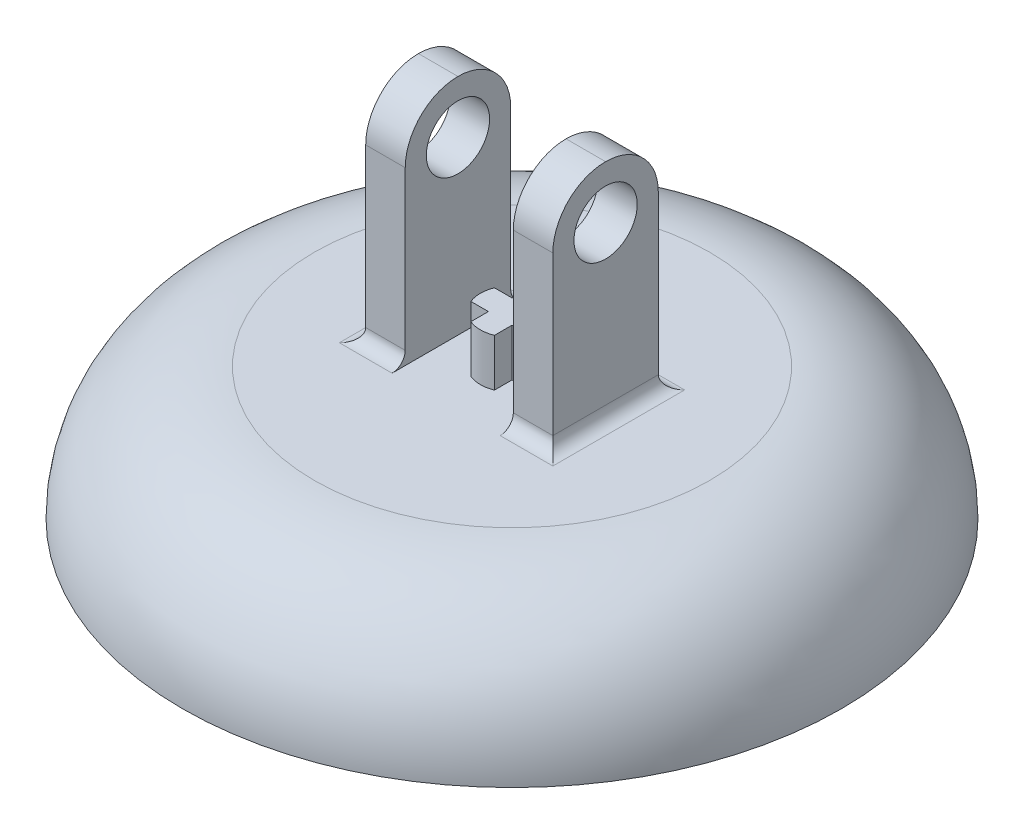
ISO-10303-21;
HEADER;
FILE_DESCRIPTION(('STEP AP214'),'2;1');
FILE_NAME('part.step','',(''),(''),'','','');
FILE_SCHEMA(('AUTOMOTIVE_DESIGN { 1 0 10303 214 1 1 1 1 }'));
ENDSEC;
DATA;
#1=APPLICATION_CONTEXT('core data for automotive mechanical design processes');
#2=APPLICATION_PROTOCOL_DEFINITION('international standard','automotive_design',2000,#1);
#3=PRODUCT_CONTEXT('',#1,'mechanical');
#4=PRODUCT('Part','Part','',(#3));
#5=PRODUCT_RELATED_PRODUCT_CATEGORY('part','',(#4));
#6=PRODUCT_DEFINITION_FORMATION('','',#4);
#7=PRODUCT_DEFINITION_CONTEXT('part definition',#1,'design');
#8=PRODUCT_DEFINITION('design','',#6,#7);
#9=PRODUCT_DEFINITION_SHAPE('','',#8);
#10=(LENGTH_UNIT() NAMED_UNIT(*) SI_UNIT(.MILLI.,.METRE.));
#11=(NAMED_UNIT(*) PLANE_ANGLE_UNIT() SI_UNIT($,.RADIAN.));
#12=(NAMED_UNIT(*) SI_UNIT($,.STERADIAN.) SOLID_ANGLE_UNIT());
#13=UNCERTAINTY_MEASURE_WITH_UNIT(LENGTH_MEASURE(1.E-05),#10,'distance_accuracy_value','');
#14=(GEOMETRIC_REPRESENTATION_CONTEXT(3) GLOBAL_UNCERTAINTY_ASSIGNED_CONTEXT((#13)) GLOBAL_UNIT_ASSIGNED_CONTEXT((#10,
#11,#12)) REPRESENTATION_CONTEXT('',''));
#15=CARTESIAN_POINT('',(0.,0.,0.));
#16=DIRECTION('',(0.,0.,1.));
#17=DIRECTION('',(1.,0.,0.));
#18=AXIS2_PLACEMENT_3D('',#15,#16,#17);
#19=CARTESIAN_POINT('',(0.,10.,0.));
#20=DIRECTION('',(0.,1.,0.));
#21=DIRECTION('',(0.,0.,1.));
#22=AXIS2_PLACEMENT_3D('',#19,#20,#21);
#23=PLANE('',#22);
#24=DIRECTION('',(1.,0.,0.));
#25=VECTOR('',#24,1.);
#26=CARTESIAN_POINT('',(4.1,10.,5.));
#27=LINE('',#26,#25);
#28=CARTESIAN_POINT('',(8.1,10.,5.));
#29=VERTEX_POINT('',#28);
#30=CARTESIAN_POINT('',(4.1,10.,5.));
#31=VERTEX_POINT('',#30);
#32=EDGE_CURVE('E288',#29,#31,#27,.F.);
#33=ORIENTED_EDGE('',*,*,#32,.T.);
#34=DIRECTION('',(0.,0.,1.));
#35=VECTOR('',#34,1.);
#36=CARTESIAN_POINT('',(4.1,10.,0.));
#37=LINE('',#36,#35);
#38=CARTESIAN_POINT('',(4.1,10.,-5.));
#39=VERTEX_POINT('',#38);
#40=EDGE_CURVE('E331',#39,#31,#37,.T.);
#41=ORIENTED_EDGE('',*,*,#40,.F.);
#42=DIRECTION('',(-1.,0.,0.));
#43=VECTOR('',#42,1.);
#44=CARTESIAN_POINT('',(7.1,10.,-5.));
#45=LINE('',#44,#43);
#46=CARTESIAN_POINT('',(8.1,10.,-5.));
#47=VERTEX_POINT('',#46);
#48=EDGE_CURVE('E284',#39,#47,#45,.F.);
#49=ORIENTED_EDGE('',*,*,#48,.T.);
#50=DIRECTION('',(0.,0.,-1.));
#51=VECTOR('',#50,1.);
#52=CARTESIAN_POINT('',(8.1,10.,4.));
#53=LINE('',#52,#51);
#54=EDGE_CURVE('E286',#47,#29,#53,.F.);
#55=ORIENTED_EDGE('',*,*,#54,.T.);
#56=EDGE_LOOP('',(#33,#41,#49,#55));
#57=FACE_BOUND('',#56,.T.);
#58=DIRECTION('',(-1.,0.,0.));
#59=VECTOR('',#58,1.);
#60=CARTESIAN_POINT('',(-4.1,10.,-5.));
#61=LINE('',#60,#59);
#62=CARTESIAN_POINT('',(-8.1,10.,-5.));
#63=VERTEX_POINT('',#62);
#64=CARTESIAN_POINT('',(-4.1,10.,-5.));
#65=VERTEX_POINT('',#64);
#66=EDGE_CURVE('E295',#63,#65,#61,.F.);
#67=ORIENTED_EDGE('',*,*,#66,.T.);
#68=DIRECTION('',(0.,0.,-1.));
#69=VECTOR('',#68,1.);
#70=CARTESIAN_POINT('',(-4.1,10.,0.));
#71=LINE('',#70,#69);
#72=CARTESIAN_POINT('',(-4.1,10.,5.));
#73=VERTEX_POINT('',#72);
#74=EDGE_CURVE('E351',#73,#65,#71,.T.);
#75=ORIENTED_EDGE('',*,*,#74,.F.);
#76=DIRECTION('',(1.,0.,0.));
#77=VECTOR('',#76,1.);
#78=CARTESIAN_POINT('',(-7.1,10.,5.));
#79=LINE('',#78,#77);
#80=CARTESIAN_POINT('',(-8.1,10.,5.));
#81=VERTEX_POINT('',#80);
#82=EDGE_CURVE('E291',#73,#81,#79,.F.);
#83=ORIENTED_EDGE('',*,*,#82,.T.);
#84=DIRECTION('',(0.,0.,1.));
#85=VECTOR('',#84,1.);
#86=CARTESIAN_POINT('',(-8.1,10.,-4.));
#87=LINE('',#86,#85);
#88=EDGE_CURVE('E293',#81,#63,#87,.F.);
#89=ORIENTED_EDGE('',*,*,#88,.T.);
#90=EDGE_LOOP('',(#67,#75,#83,#89));
#91=FACE_BOUND('',#90,.T.);
#92=CARTESIAN_POINT('',(0.,10.,0.));
#93=DIRECTION('',(0.,1.,0.));
#94=DIRECTION('',(0.,0.,1.));
#95=AXIS2_PLACEMENT_3D('',#92,#93,#94);
#96=CIRCLE('',#95,15.);
#97=CARTESIAN_POINT('',(0.,10.,15.));
#98=VERTEX_POINT('',#97);
#99=EDGE_CURVE('E239',#98,#98,#96,.T.);
#100=ORIENTED_EDGE('',*,*,#99,.T.);
#101=EDGE_LOOP('',(#100));
#102=FACE_BOUND('',#101,.T.);
#103=DIRECTION('',(0.,0.,-1.));
#104=VECTOR('',#103,1.);
#105=CARTESIAN_POINT('',(0.895,10.,2.22687561394883));
#106=LINE('',#105,#104);
#107=CARTESIAN_POINT('',(0.895,10.,2.22687561394883));
#108=VERTEX_POINT('',#107);
#109=CARTESIAN_POINT('',(0.895,10.,0.895));
#110=VERTEX_POINT('',#109);
#111=EDGE_CURVE('E381',#108,#110,#106,.T.);
#112=ORIENTED_EDGE('',*,*,#111,.F.);
#113=CARTESIAN_POINT('',(0.,10.,0.));
#114=DIRECTION('',(0.,1.,0.));
#115=DIRECTION('',(0.,0.,1.));
#116=AXIS2_PLACEMENT_3D('',#113,#114,#115);
#117=CIRCLE('',#116,2.4);
#118=CARTESIAN_POINT('',(-0.895,10.,2.22687561394883));
#119=VERTEX_POINT('',#118);
#120=EDGE_CURVE('E234',#119,#108,#117,.T.);
#121=ORIENTED_EDGE('',*,*,#120,.F.);
#122=DIRECTION('',(0.,0.,1.));
#123=VECTOR('',#122,1.);
#124=CARTESIAN_POINT('',(-0.895,10.,2.22687561394883));
#125=LINE('',#124,#123);
#126=CARTESIAN_POINT('',(-0.895,10.,0.895));
#127=VERTEX_POINT('',#126);
#128=EDGE_CURVE('E230',#127,#119,#125,.T.);
#129=ORIENTED_EDGE('',*,*,#128,.F.);
#130=DIRECTION('',(1.,0.,0.));
#131=VECTOR('',#130,1.);
#132=CARTESIAN_POINT('',(-2.22687561394883,10.,0.895));
#133=LINE('',#132,#131);
#134=CARTESIAN_POINT('',(-2.22687561394883,10.,0.895));
#135=VERTEX_POINT('',#134);
#136=EDGE_CURVE('E399',#135,#127,#133,.T.);
#137=ORIENTED_EDGE('',*,*,#136,.F.);
#138=CARTESIAN_POINT('',(0.,10.,0.));
#139=DIRECTION('',(0.,1.,0.));
#140=DIRECTION('',(0.,0.,1.));
#141=AXIS2_PLACEMENT_3D('',#138,#139,#140);
#142=CIRCLE('',#141,2.4);
#143=CARTESIAN_POINT('',(-2.22687561394883,10.,-0.895000000000001));
#144=VERTEX_POINT('',#143);
#145=EDGE_CURVE('E397',#144,#135,#142,.T.);
#146=ORIENTED_EDGE('',*,*,#145,.F.);
#147=DIRECTION('',(-1.,0.,0.));
#148=VECTOR('',#147,1.);
#149=CARTESIAN_POINT('',(-2.22687561394883,10.,-0.895));
#150=LINE('',#149,#148);
#151=CARTESIAN_POINT('',(-0.895,10.,-0.895));
#152=VERTEX_POINT('',#151);
#153=EDGE_CURVE('E395',#152,#144,#150,.T.);
#154=ORIENTED_EDGE('',*,*,#153,.F.);
#155=DIRECTION('',(0.,0.,1.));
#156=VECTOR('',#155,1.);
#157=CARTESIAN_POINT('',(-0.895,10.,-2.22687561394883));
#158=LINE('',#157,#156);
#159=CARTESIAN_POINT('',(-0.895,10.,-2.22687561394883));
#160=VERTEX_POINT('',#159);
#161=EDGE_CURVE('E393',#160,#152,#158,.T.);
#162=ORIENTED_EDGE('',*,*,#161,.F.);
#163=CARTESIAN_POINT('',(0.,10.,0.));
#164=DIRECTION('',(0.,1.,0.));
#165=DIRECTION('',(0.,0.,1.));
#166=AXIS2_PLACEMENT_3D('',#163,#164,#165);
#167=CIRCLE('',#166,2.4);
#168=CARTESIAN_POINT('',(0.895000000000001,10.,-2.22687561394883));
#169=VERTEX_POINT('',#168);
#170=EDGE_CURVE('E391',#169,#160,#167,.T.);
#171=ORIENTED_EDGE('',*,*,#170,.F.);
#172=DIRECTION('',(0.,0.,-1.));
#173=VECTOR('',#172,1.);
#174=CARTESIAN_POINT('',(0.895,10.,-2.22687561394883));
#175=LINE('',#174,#173);
#176=CARTESIAN_POINT('',(0.895,10.,-0.895));
#177=VERTEX_POINT('',#176);
#178=EDGE_CURVE('E389',#177,#169,#175,.T.);
#179=ORIENTED_EDGE('',*,*,#178,.F.);
#180=DIRECTION('',(-1.,0.,0.));
#181=VECTOR('',#180,1.);
#182=CARTESIAN_POINT('',(2.22687561394883,10.,-0.895));
#183=LINE('',#182,#181);
#184=CARTESIAN_POINT('',(2.22687561394883,10.,-0.895));
#185=VERTEX_POINT('',#184);
#186=EDGE_CURVE('E387',#185,#177,#183,.T.);
#187=ORIENTED_EDGE('',*,*,#186,.F.);
#188=CARTESIAN_POINT('',(0.,10.,0.));
#189=DIRECTION('',(0.,1.,0.));
#190=DIRECTION('',(0.,0.,1.));
#191=AXIS2_PLACEMENT_3D('',#188,#189,#190);
#192=CIRCLE('',#191,2.4);
#193=CARTESIAN_POINT('',(2.22687561394883,10.,0.895));
#194=VERTEX_POINT('',#193);
#195=EDGE_CURVE('E385',#194,#185,#192,.T.);
#196=ORIENTED_EDGE('',*,*,#195,.F.);
#197=DIRECTION('',(1.,0.,0.));
#198=VECTOR('',#197,1.);
#199=CARTESIAN_POINT('',(2.22687561394883,10.,0.895));
#200=LINE('',#199,#198);
#201=EDGE_CURVE('E383',#110,#194,#200,.T.);
#202=ORIENTED_EDGE('',*,*,#201,.F.);
#203=EDGE_LOOP('',(#112,#121,#129,#137,#146,#154,#162,#171,#179,#187,#196,#202));
#204=FACE_BOUND('',#203,.T.);
#205=ADVANCED_FACE('F33',(#57,#91,#102,#204),#23,.T.);
#206=CARTESIAN_POINT('',(0.,0.,0.));
#207=DIRECTION('',(0.,1.,0.));
#208=DIRECTION('',(0.,0.,1.));
#209=AXIS2_PLACEMENT_3D('',#206,#207,#208);
#210=PLANE('',#209);
#211=CARTESIAN_POINT('',(0.,0.,0.));
#212=DIRECTION('',(0.,1.,0.));
#213=DIRECTION('',(0.,0.,1.));
#214=AXIS2_PLACEMENT_3D('',#211,#212,#213);
#215=CIRCLE('',#214,25.);
#216=CARTESIAN_POINT('',(0.,0.,25.));
#217=VERTEX_POINT('',#216);
#218=EDGE_CURVE('E236',#217,#217,#215,.T.);
#219=ORIENTED_EDGE('',*,*,#218,.F.);
#220=EDGE_LOOP('',(#219));
#221=FACE_BOUND('',#220,.T.);
#222=ADVANCED_FACE('F459',(#221),#210,.F.);
#223=CARTESIAN_POINT('',(0.,0.,0.));
#224=DIRECTION('',(0.,1.,0.));
#225=DIRECTION('',(0.,0.,1.));
#226=AXIS2_PLACEMENT_3D('',#223,#224,#225);
#227=TOROIDAL_SURFACE('',#226,15.,10.);
#228=ORIENTED_EDGE('',*,*,#218,.T.);
#229=EDGE_LOOP('',(#228));
#230=FACE_BOUND('',#229,.T.);
#231=ORIENTED_EDGE('',*,*,#99,.F.);
#232=EDGE_LOOP('',(#231));
#233=FACE_BOUND('',#232,.T.);
#234=ADVANCED_FACE('F465',(#230,#233),#227,.T.);
#235=CARTESIAN_POINT('',(0.,13.6,0.));
#236=DIRECTION('',(0.,-1.,0.));
#237=DIRECTION('',(0.,0.,-1.));
#238=AXIS2_PLACEMENT_3D('',#235,#236,#237);
#239=CYLINDRICAL_SURFACE('',#238,2.4);
#240=ORIENTED_EDGE('',*,*,#120,.T.);
#241=DIRECTION('',(0.,-1.,0.));
#242=VECTOR('',#241,1.);
#243=CARTESIAN_POINT('',(0.895,13.6,2.22687561394883));
#244=LINE('',#243,#242);
#245=CARTESIAN_POINT('',(0.895,13.6,2.22687561394883));
#246=VERTEX_POINT('',#245);
#247=EDGE_CURVE('E214',#246,#108,#244,.T.);
#248=ORIENTED_EDGE('',*,*,#247,.F.);
#249=CARTESIAN_POINT('',(0.,13.6,0.));
#250=DIRECTION('',(0.,1.,0.));
#251=DIRECTION('',(0.,0.,1.));
#252=AXIS2_PLACEMENT_3D('',#249,#250,#251);
#253=CIRCLE('',#252,2.4);
#254=CARTESIAN_POINT('',(-0.895,13.6,2.22687561394883));
#255=VERTEX_POINT('',#254);
#256=EDGE_CURVE('E221',#255,#246,#253,.T.);
#257=ORIENTED_EDGE('',*,*,#256,.F.);
#258=DIRECTION('',(0.,-1.,0.));
#259=VECTOR('',#258,1.);
#260=CARTESIAN_POINT('',(-0.895,13.6,2.22687561394883));
#261=LINE('',#260,#259);
#262=EDGE_CURVE('E379',#255,#119,#261,.T.);
#263=ORIENTED_EDGE('',*,*,#262,.T.);
#264=EDGE_LOOP('',(#240,#248,#257,#263));
#265=FACE_BOUND('',#264,.T.);
#266=ADVANCED_FACE('F232',(#265),#239,.T.);
#267=CARTESIAN_POINT('',(0.895,13.6,2.22687561394883));
#268=DIRECTION('',(-1.,0.,0.));
#269=DIRECTION('',(0.,0.,1.));
#270=AXIS2_PLACEMENT_3D('',#267,#268,#269);
#271=PLANE('',#270);
#272=ORIENTED_EDGE('',*,*,#111,.T.);
#273=DIRECTION('',(0.,-1.,0.));
#274=VECTOR('',#273,1.);
#275=CARTESIAN_POINT('',(0.895,13.6,0.895));
#276=LINE('',#275,#274);
#277=CARTESIAN_POINT('',(0.895,13.6,0.895));
#278=VERTEX_POINT('',#277);
#279=EDGE_CURVE('E217',#278,#110,#276,.T.);
#280=ORIENTED_EDGE('',*,*,#279,.F.);
#281=DIRECTION('',(0.,0.,-1.));
#282=VECTOR('',#281,1.);
#283=CARTESIAN_POINT('',(0.895,13.6,2.22687561394883));
#284=LINE('',#283,#282);
#285=EDGE_CURVE('E210',#246,#278,#284,.T.);
#286=ORIENTED_EDGE('',*,*,#285,.F.);
#287=ORIENTED_EDGE('',*,*,#247,.T.);
#288=EDGE_LOOP('',(#272,#280,#286,#287));
#289=FACE_BOUND('',#288,.T.);
#290=ADVANCED_FACE('F212',(#289),#271,.F.);
#291=CARTESIAN_POINT('',(2.22687561394883,13.6,0.895));
#292=DIRECTION('',(0.,0.,-1.));
#293=DIRECTION('',(-1.,0.,0.));
#294=AXIS2_PLACEMENT_3D('',#291,#292,#293);
#295=PLANE('',#294);
#296=ORIENTED_EDGE('',*,*,#201,.T.);
#297=DIRECTION('',(0.,-1.,0.));
#298=VECTOR('',#297,1.);
#299=CARTESIAN_POINT('',(2.22687561394883,13.6,0.895));
#300=LINE('',#299,#298);
#301=CARTESIAN_POINT('',(2.22687561394883,13.6,0.895));
#302=VERTEX_POINT('',#301);
#303=EDGE_CURVE('E241',#302,#194,#300,.T.);
#304=ORIENTED_EDGE('',*,*,#303,.F.);
#305=DIRECTION('',(1.,0.,0.));
#306=VECTOR('',#305,1.);
#307=CARTESIAN_POINT('',(2.22687561394883,13.6,0.895));
#308=LINE('',#307,#306);
#309=EDGE_CURVE('E220',#278,#302,#308,.T.);
#310=ORIENTED_EDGE('',*,*,#309,.F.);
#311=ORIENTED_EDGE('',*,*,#279,.T.);
#312=EDGE_LOOP('',(#296,#304,#310,#311));
#313=FACE_BOUND('',#312,.T.);
#314=ADVANCED_FACE('F449',(#313),#295,.F.);
#315=CARTESIAN_POINT('',(0.,13.6,0.));
#316=DIRECTION('',(0.,-1.,0.));
#317=DIRECTION('',(0.,0.,-1.));
#318=AXIS2_PLACEMENT_3D('',#315,#316,#317);
#319=CYLINDRICAL_SURFACE('',#318,2.4);
#320=ORIENTED_EDGE('',*,*,#195,.T.);
#321=DIRECTION('',(0.,-1.,0.));
#322=VECTOR('',#321,1.);
#323=CARTESIAN_POINT('',(2.22687561394883,13.6,-0.895));
#324=LINE('',#323,#322);
#325=CARTESIAN_POINT('',(2.22687561394883,13.6,-0.895));
#326=VERTEX_POINT('',#325);
#327=EDGE_CURVE('E424',#326,#185,#324,.T.);
#328=ORIENTED_EDGE('',*,*,#327,.F.);
#329=CARTESIAN_POINT('',(0.,13.6,0.));
#330=DIRECTION('',(0.,1.,0.));
#331=DIRECTION('',(0.,0.,1.));
#332=AXIS2_PLACEMENT_3D('',#329,#330,#331);
#333=CIRCLE('',#332,2.4);
#334=EDGE_CURVE('E362',#302,#326,#333,.T.);
#335=ORIENTED_EDGE('',*,*,#334,.F.);
#336=ORIENTED_EDGE('',*,*,#303,.T.);
#337=EDGE_LOOP('',(#320,#328,#335,#336));
#338=FACE_BOUND('',#337,.T.);
#339=ADVANCED_FACE('F431',(#338),#319,.T.);
#340=CARTESIAN_POINT('',(2.22687561394883,13.6,-0.895));
#341=DIRECTION('',(0.,0.,1.));
#342=DIRECTION('',(1.,0.,0.));
#343=AXIS2_PLACEMENT_3D('',#340,#341,#342);
#344=PLANE('',#343);
#345=ORIENTED_EDGE('',*,*,#186,.T.);
#346=DIRECTION('',(0.,-1.,0.));
#347=VECTOR('',#346,1.);
#348=CARTESIAN_POINT('',(0.895,13.6,-0.895));
#349=LINE('',#348,#347);
#350=CARTESIAN_POINT('',(0.895,13.6,-0.895));
#351=VERTEX_POINT('',#350);
#352=EDGE_CURVE('E421',#351,#177,#349,.T.);
#353=ORIENTED_EDGE('',*,*,#352,.F.);
#354=DIRECTION('',(-1.,0.,0.));
#355=VECTOR('',#354,1.);
#356=CARTESIAN_POINT('',(2.22687561394883,13.6,-0.895));
#357=LINE('',#356,#355);
#358=EDGE_CURVE('E364',#326,#351,#357,.T.);
#359=ORIENTED_EDGE('',*,*,#358,.F.);
#360=ORIENTED_EDGE('',*,*,#327,.T.);
#361=EDGE_LOOP('',(#345,#353,#359,#360));
#362=FACE_BOUND('',#361,.T.);
#363=ADVANCED_FACE('F441',(#362),#344,.F.);
#364=CARTESIAN_POINT('',(0.895,13.6,-2.22687561394883));
#365=DIRECTION('',(-1.,0.,0.));
#366=DIRECTION('',(0.,0.,1.));
#367=AXIS2_PLACEMENT_3D('',#364,#365,#366);
#368=PLANE('',#367);
#369=ORIENTED_EDGE('',*,*,#178,.T.);
#370=DIRECTION('',(0.,-1.,0.));
#371=VECTOR('',#370,1.);
#372=CARTESIAN_POINT('',(0.895000000000001,13.6,-2.22687561394883));
#373=LINE('',#372,#371);
#374=CARTESIAN_POINT('',(0.895000000000001,13.6,-2.22687561394883));
#375=VERTEX_POINT('',#374);
#376=EDGE_CURVE('E418',#375,#169,#373,.T.);
#377=ORIENTED_EDGE('',*,*,#376,.F.);
#378=DIRECTION('',(0.,0.,-1.));
#379=VECTOR('',#378,1.);
#380=CARTESIAN_POINT('',(0.895,13.6,-2.22687561394883));
#381=LINE('',#380,#379);
#382=EDGE_CURVE('E366',#351,#375,#381,.T.);
#383=ORIENTED_EDGE('',*,*,#382,.F.);
#384=ORIENTED_EDGE('',*,*,#352,.T.);
#385=EDGE_LOOP('',(#369,#377,#383,#384));
#386=FACE_BOUND('',#385,.T.);
#387=ADVANCED_FACE('F445',(#386),#368,.F.);
#388=CARTESIAN_POINT('',(0.,13.6,0.));
#389=DIRECTION('',(0.,-1.,0.));
#390=DIRECTION('',(0.,0.,-1.));
#391=AXIS2_PLACEMENT_3D('',#388,#389,#390);
#392=CYLINDRICAL_SURFACE('',#391,2.4);
#393=ORIENTED_EDGE('',*,*,#170,.T.);
#394=DIRECTION('',(0.,-1.,0.));
#395=VECTOR('',#394,1.);
#396=CARTESIAN_POINT('',(-0.895,13.6,-2.22687561394883));
#397=LINE('',#396,#395);
#398=CARTESIAN_POINT('',(-0.895,13.6,-2.22687561394883));
#399=VERTEX_POINT('',#398);
#400=EDGE_CURVE('E415',#399,#160,#397,.T.);
#401=ORIENTED_EDGE('',*,*,#400,.F.);
#402=CARTESIAN_POINT('',(0.,13.6,0.));
#403=DIRECTION('',(0.,1.,0.));
#404=DIRECTION('',(0.,0.,1.));
#405=AXIS2_PLACEMENT_3D('',#402,#403,#404);
#406=CIRCLE('',#405,2.4);
#407=EDGE_CURVE('E368',#375,#399,#406,.T.);
#408=ORIENTED_EDGE('',*,*,#407,.F.);
#409=ORIENTED_EDGE('',*,*,#376,.T.);
#410=EDGE_LOOP('',(#393,#401,#408,#409));
#411=FACE_BOUND('',#410,.T.);
#412=ADVANCED_FACE('F661',(#411),#392,.T.);
#413=CARTESIAN_POINT('',(-0.895,13.6,-2.22687561394883));
#414=DIRECTION('',(1.,0.,0.));
#415=DIRECTION('',(0.,0.,-1.));
#416=AXIS2_PLACEMENT_3D('',#413,#414,#415);
#417=PLANE('',#416);
#418=ORIENTED_EDGE('',*,*,#161,.T.);
#419=DIRECTION('',(0.,-1.,0.));
#420=VECTOR('',#419,1.);
#421=CARTESIAN_POINT('',(-0.895,13.6,-0.895));
#422=LINE('',#421,#420);
#423=CARTESIAN_POINT('',(-0.895,13.6,-0.895));
#424=VERTEX_POINT('',#423);
#425=EDGE_CURVE('E412',#424,#152,#422,.T.);
#426=ORIENTED_EDGE('',*,*,#425,.F.);
#427=DIRECTION('',(0.,0.,1.));
#428=VECTOR('',#427,1.);
#429=CARTESIAN_POINT('',(-0.895,13.6,-2.22687561394883));
#430=LINE('',#429,#428);
#431=EDGE_CURVE('E370',#399,#424,#430,.T.);
#432=ORIENTED_EDGE('',*,*,#431,.F.);
#433=ORIENTED_EDGE('',*,*,#400,.T.);
#434=EDGE_LOOP('',(#418,#426,#432,#433));
#435=FACE_BOUND('',#434,.T.);
#436=ADVANCED_FACE('F653',(#435),#417,.F.);
#437=CARTESIAN_POINT('',(-2.22687561394883,13.6,-0.895));
#438=DIRECTION('',(0.,0.,1.));
#439=DIRECTION('',(1.,0.,0.));
#440=AXIS2_PLACEMENT_3D('',#437,#438,#439);
#441=PLANE('',#440);
#442=ORIENTED_EDGE('',*,*,#153,.T.);
#443=DIRECTION('',(0.,-1.,0.));
#444=VECTOR('',#443,1.);
#445=CARTESIAN_POINT('',(-2.22687561394883,13.6,-0.895000000000001));
#446=LINE('',#445,#444);
#447=CARTESIAN_POINT('',(-2.22687561394883,13.6,-0.895000000000001));
#448=VERTEX_POINT('',#447);
#449=EDGE_CURVE('E409',#448,#144,#446,.T.);
#450=ORIENTED_EDGE('',*,*,#449,.F.);
#451=DIRECTION('',(-1.,0.,0.));
#452=VECTOR('',#451,1.);
#453=CARTESIAN_POINT('',(-2.22687561394883,13.6,-0.895));
#454=LINE('',#453,#452);
#455=EDGE_CURVE('E372',#424,#448,#454,.T.);
#456=ORIENTED_EDGE('',*,*,#455,.F.);
#457=ORIENTED_EDGE('',*,*,#425,.T.);
#458=EDGE_LOOP('',(#442,#450,#456,#457));
#459=FACE_BOUND('',#458,.T.);
#460=ADVANCED_FACE('F645',(#459),#441,.F.);
#461=CARTESIAN_POINT('',(0.,13.6,0.));
#462=DIRECTION('',(0.,-1.,0.));
#463=DIRECTION('',(0.,0.,-1.));
#464=AXIS2_PLACEMENT_3D('',#461,#462,#463);
#465=CYLINDRICAL_SURFACE('',#464,2.4);
#466=ORIENTED_EDGE('',*,*,#145,.T.);
#467=DIRECTION('',(0.,-1.,0.));
#468=VECTOR('',#467,1.);
#469=CARTESIAN_POINT('',(-2.22687561394883,13.6,0.895));
#470=LINE('',#469,#468);
#471=CARTESIAN_POINT('',(-2.22687561394883,13.6,0.895));
#472=VERTEX_POINT('',#471);
#473=EDGE_CURVE('E406',#472,#135,#470,.T.);
#474=ORIENTED_EDGE('',*,*,#473,.F.);
#475=CARTESIAN_POINT('',(0.,13.6,0.));
#476=DIRECTION('',(0.,1.,0.));
#477=DIRECTION('',(0.,0.,1.));
#478=AXIS2_PLACEMENT_3D('',#475,#476,#477);
#479=CIRCLE('',#478,2.4);
#480=EDGE_CURVE('E374',#448,#472,#479,.T.);
#481=ORIENTED_EDGE('',*,*,#480,.F.);
#482=ORIENTED_EDGE('',*,*,#449,.T.);
#483=EDGE_LOOP('',(#466,#474,#481,#482));
#484=FACE_BOUND('',#483,.T.);
#485=ADVANCED_FACE('F637',(#484),#465,.T.);
#486=CARTESIAN_POINT('',(-2.22687561394883,13.6,0.895));
#487=DIRECTION('',(0.,0.,-1.));
#488=DIRECTION('',(-1.,0.,0.));
#489=AXIS2_PLACEMENT_3D('',#486,#487,#488);
#490=PLANE('',#489);
#491=ORIENTED_EDGE('',*,*,#136,.T.);
#492=DIRECTION('',(0.,-1.,0.));
#493=VECTOR('',#492,1.);
#494=CARTESIAN_POINT('',(-0.895,13.6,0.895));
#495=LINE('',#494,#493);
#496=CARTESIAN_POINT('',(-0.895,13.6,0.895));
#497=VERTEX_POINT('',#496);
#498=EDGE_CURVE('E404',#497,#127,#495,.T.);
#499=ORIENTED_EDGE('',*,*,#498,.F.);
#500=DIRECTION('',(1.,0.,0.));
#501=VECTOR('',#500,1.);
#502=CARTESIAN_POINT('',(-2.22687561394883,13.6,0.895));
#503=LINE('',#502,#501);
#504=EDGE_CURVE('E376',#472,#497,#503,.T.);
#505=ORIENTED_EDGE('',*,*,#504,.F.);
#506=ORIENTED_EDGE('',*,*,#473,.T.);
#507=EDGE_LOOP('',(#491,#499,#505,#506));
#508=FACE_BOUND('',#507,.T.);
#509=ADVANCED_FACE('F629',(#508),#490,.F.);
#510=CARTESIAN_POINT('',(-0.895,13.6,2.22687561394883));
#511=DIRECTION('',(1.,0.,0.));
#512=DIRECTION('',(0.,0.,-1.));
#513=AXIS2_PLACEMENT_3D('',#510,#511,#512);
#514=PLANE('',#513);
#515=ORIENTED_EDGE('',*,*,#128,.T.);
#516=ORIENTED_EDGE('',*,*,#262,.F.);
#517=DIRECTION('',(0.,0.,1.));
#518=VECTOR('',#517,1.);
#519=CARTESIAN_POINT('',(-0.895,13.6,2.22687561394883));
#520=LINE('',#519,#518);
#521=EDGE_CURVE('E226',#497,#255,#520,.T.);
#522=ORIENTED_EDGE('',*,*,#521,.F.);
#523=ORIENTED_EDGE('',*,*,#498,.T.);
#524=EDGE_LOOP('',(#515,#516,#522,#523));
#525=FACE_BOUND('',#524,.T.);
#526=ADVANCED_FACE('F622',(#525),#514,.F.);
#527=CARTESIAN_POINT('',(0.,13.6,0.));
#528=DIRECTION('',(0.,1.,0.));
#529=DIRECTION('',(0.,0.,1.));
#530=AXIS2_PLACEMENT_3D('',#527,#528,#529);
#531=PLANE('',#530);
#532=ORIENTED_EDGE('',*,*,#256,.T.);
#533=ORIENTED_EDGE('',*,*,#285,.T.);
#534=ORIENTED_EDGE('',*,*,#309,.T.);
#535=ORIENTED_EDGE('',*,*,#334,.T.);
#536=ORIENTED_EDGE('',*,*,#358,.T.);
#537=ORIENTED_EDGE('',*,*,#382,.T.);
#538=ORIENTED_EDGE('',*,*,#407,.T.);
#539=ORIENTED_EDGE('',*,*,#431,.T.);
#540=ORIENTED_EDGE('',*,*,#455,.T.);
#541=ORIENTED_EDGE('',*,*,#480,.T.);
#542=ORIENTED_EDGE('',*,*,#504,.T.);
#543=ORIENTED_EDGE('',*,*,#521,.T.);
#544=EDGE_LOOP('',(#532,#533,#534,#535,#536,#537,#538,#539,#540,#541,#542,#543));
#545=FACE_BOUND('',#544,.T.);
#546=ADVANCED_FACE('F224',(#545),#531,.T.);
#547=CARTESIAN_POINT('',(-7.1,27.,4.));
#548=DIRECTION('',(-1.,0.,0.));
#549=DIRECTION('',(0.,0.,1.));
#550=AXIS2_PLACEMENT_3D('',#547,#548,#549);
#551=PLANE('',#550);
#552=CARTESIAN_POINT('',(-7.1,23.,0.));
#553=DIRECTION('',(-1.,0.,0.));
#554=DIRECTION('',(0.,0.,1.));
#555=AXIS2_PLACEMENT_3D('',#552,#553,#554);
#556=CIRCLE('',#555,2.4);
#557=CARTESIAN_POINT('',(-7.1,23.,2.4));
#558=VERTEX_POINT('',#557);
#559=EDGE_CURVE('E336',#558,#558,#556,.T.);
#560=ORIENTED_EDGE('',*,*,#559,.F.);
#561=EDGE_LOOP('',(#560));
#562=FACE_BOUND('',#561,.T.);
#563=DIRECTION('',(0.,-1.,0.));
#564=VECTOR('',#563,1.);
#565=CARTESIAN_POINT('',(-7.1,27.,-4.));
#566=LINE('',#565,#564);
#567=CARTESIAN_POINT('',(-7.1,23.,-4.));
#568=VERTEX_POINT('',#567);
#569=CARTESIAN_POINT('',(-7.1,11.,-4.));
#570=VERTEX_POINT('',#569);
#571=EDGE_CURVE('E346',#568,#570,#566,.T.);
#572=ORIENTED_EDGE('',*,*,#571,.T.);
#573=DIRECTION('',(0.,0.,1.));
#574=VECTOR('',#573,1.);
#575=CARTESIAN_POINT('',(-7.1,11.,4.));
#576=LINE('',#575,#574);
#577=CARTESIAN_POINT('',(-7.1,11.,4.));
#578=VERTEX_POINT('',#577);
#579=EDGE_CURVE('E298',#570,#578,#576,.T.);
#580=ORIENTED_EDGE('',*,*,#579,.T.);
#581=DIRECTION('',(0.,-1.,0.));
#582=VECTOR('',#581,1.);
#583=CARTESIAN_POINT('',(-7.1,27.,4.));
#584=LINE('',#583,#582);
#585=CARTESIAN_POINT('',(-7.1,23.,4.));
#586=VERTEX_POINT('',#585);
#587=EDGE_CURVE('E348',#586,#578,#584,.T.);
#588=ORIENTED_EDGE('',*,*,#587,.F.);
#589=CARTESIAN_POINT('',(-7.1,23.,0.));
#590=DIRECTION('',(-1.,0.,0.));
#591=DIRECTION('',(0.,0.,1.));
#592=AXIS2_PLACEMENT_3D('',#589,#590,#591);
#593=CIRCLE('',#592,4.);
#594=CARTESIAN_POINT('',(-7.1,27.,0.));
#595=VERTEX_POINT('',#594);
#596=EDGE_CURVE('E265',#586,#595,#593,.T.);
#597=ORIENTED_EDGE('',*,*,#596,.T.);
#598=CARTESIAN_POINT('',(-7.1,23.,0.));
#599=DIRECTION('',(-1.,0.,0.));
#600=DIRECTION('',(0.,0.,1.));
#601=AXIS2_PLACEMENT_3D('',#598,#599,#600);
#602=CIRCLE('',#601,4.);
#603=EDGE_CURVE('E263',#595,#568,#602,.T.);
#604=ORIENTED_EDGE('',*,*,#603,.T.);
#605=EDGE_LOOP('',(#572,#580,#588,#597,#604));
#606=FACE_BOUND('',#605,.T.);
#607=ADVANCED_FACE('F607',(#562,#606),#551,.T.);
#608=CARTESIAN_POINT('',(-7.1,27.,4.));
#609=DIRECTION('',(0.,0.,1.));
#610=DIRECTION('',(1.,0.,0.));
#611=AXIS2_PLACEMENT_3D('',#608,#609,#610);
#612=PLANE('',#611);
#613=ORIENTED_EDGE('',*,*,#587,.T.);
#614=DIRECTION('',(1.,0.,0.));
#615=VECTOR('',#614,1.);
#616=CARTESIAN_POINT('',(-4.1,11.,4.));
#617=LINE('',#616,#615);
#618=CARTESIAN_POINT('',(-4.1,11.,4.));
#619=VERTEX_POINT('',#618);
#620=EDGE_CURVE('E300',#578,#619,#617,.T.);
#621=ORIENTED_EDGE('',*,*,#620,.T.);
#622=DIRECTION('',(0.,-1.,0.));
#623=VECTOR('',#622,1.);
#624=CARTESIAN_POINT('',(-4.1,27.,4.));
#625=LINE('',#624,#623);
#626=CARTESIAN_POINT('',(-4.1,23.,4.));
#627=VERTEX_POINT('',#626);
#628=EDGE_CURVE('E352',#627,#619,#625,.T.);
#629=ORIENTED_EDGE('',*,*,#628,.F.);
#630=DIRECTION('',(-1.,0.,0.));
#631=VECTOR('',#630,1.);
#632=CARTESIAN_POINT('',(-7.1,23.,4.));
#633=LINE('',#632,#631);
#634=EDGE_CURVE('E260',#627,#586,#633,.T.);
#635=ORIENTED_EDGE('',*,*,#634,.T.);
#636=EDGE_LOOP('',(#613,#621,#629,#635));
#637=FACE_BOUND('',#636,.T.);
#638=ADVANCED_FACE('F599',(#637),#612,.T.);
#639=CARTESIAN_POINT('',(-4.1,27.,4.));
#640=DIRECTION('',(1.,0.,0.));
#641=DIRECTION('',(0.,0.,-1.));
#642=AXIS2_PLACEMENT_3D('',#639,#640,#641);
#643=PLANE('',#642);
#644=CARTESIAN_POINT('',(-4.1,23.,0.));
#645=DIRECTION('',(1.,0.,0.));
#646=DIRECTION('',(0.,0.,-1.));
#647=AXIS2_PLACEMENT_3D('',#644,#645,#646);
#648=CIRCLE('',#647,2.4);
#649=CARTESIAN_POINT('',(-4.1,23.,-2.4));
#650=VERTEX_POINT('',#649);
#651=EDGE_CURVE('E341',#650,#650,#648,.T.);
#652=ORIENTED_EDGE('',*,*,#651,.F.);
#653=EDGE_LOOP('',(#652));
#654=FACE_BOUND('',#653,.T.);
#655=CARTESIAN_POINT('',(-4.1,23.,0.));
#656=DIRECTION('',(1.,0.,0.));
#657=DIRECTION('',(0.,0.,-1.));
#658=AXIS2_PLACEMENT_3D('',#655,#656,#657);
#659=CIRCLE('',#658,4.);
#660=CARTESIAN_POINT('',(-4.1,23.,-4.));
#661=VERTEX_POINT('',#660);
#662=CARTESIAN_POINT('',(-4.1,27.,0.));
#663=VERTEX_POINT('',#662);
#664=EDGE_CURVE('E267',#661,#663,#659,.T.);
#665=ORIENTED_EDGE('',*,*,#664,.T.);
#666=CARTESIAN_POINT('',(-4.1,23.,0.));
#667=DIRECTION('',(1.,0.,0.));
#668=DIRECTION('',(0.,0.,-1.));
#669=AXIS2_PLACEMENT_3D('',#666,#667,#668);
#670=CIRCLE('',#669,4.);
#671=EDGE_CURVE('E269',#663,#627,#670,.T.);
#672=ORIENTED_EDGE('',*,*,#671,.T.);
#673=ORIENTED_EDGE('',*,*,#628,.T.);
#674=CARTESIAN_POINT('',(-4.1,11.,5.));
#675=DIRECTION('',(1.,0.,0.));
#676=DIRECTION('',(0.,0.,-1.));
#677=AXIS2_PLACEMENT_3D('',#674,#675,#676);
#678=CIRCLE('',#677,1.);
#679=EDGE_CURVE('E309',#619,#73,#678,.F.);
#680=ORIENTED_EDGE('',*,*,#679,.T.);
#681=ORIENTED_EDGE('',*,*,#74,.T.);
#682=CARTESIAN_POINT('',(-4.1,11.,-5.));
#683=DIRECTION('',(1.,0.,0.));
#684=DIRECTION('',(0.,0.,-1.));
#685=AXIS2_PLACEMENT_3D('',#682,#683,#684);
#686=CIRCLE('',#685,1.);
#687=CARTESIAN_POINT('',(-4.1,11.,-4.));
#688=VERTEX_POINT('',#687);
#689=EDGE_CURVE('E307',#65,#688,#686,.F.);
#690=ORIENTED_EDGE('',*,*,#689,.T.);
#691=DIRECTION('',(0.,-1.,0.));
#692=VECTOR('',#691,1.);
#693=CARTESIAN_POINT('',(-4.1,27.,-4.));
#694=LINE('',#693,#692);
#695=EDGE_CURVE('E355',#661,#688,#694,.T.);
#696=ORIENTED_EDGE('',*,*,#695,.F.);
#697=EDGE_LOOP('',(#665,#672,#673,#680,#681,#690,#696));
#698=FACE_BOUND('',#697,.T.);
#699=ADVANCED_FACE('F591',(#654,#698),#643,.T.);
#700=CARTESIAN_POINT('',(-7.1,27.,-4.));
#701=DIRECTION('',(0.,0.,-1.));
#702=DIRECTION('',(-1.,0.,0.));
#703=AXIS2_PLACEMENT_3D('',#700,#701,#702);
#704=PLANE('',#703);
#705=ORIENTED_EDGE('',*,*,#695,.T.);
#706=DIRECTION('',(-1.,0.,0.));
#707=VECTOR('',#706,1.);
#708=CARTESIAN_POINT('',(-7.1,11.,-4.));
#709=LINE('',#708,#707);
#710=EDGE_CURVE('E273',#688,#570,#709,.T.);
#711=ORIENTED_EDGE('',*,*,#710,.T.);
#712=ORIENTED_EDGE('',*,*,#571,.F.);
#713=DIRECTION('',(1.,0.,0.));
#714=VECTOR('',#713,1.);
#715=CARTESIAN_POINT('',(-4.1,23.,-4.));
#716=LINE('',#715,#714);
#717=EDGE_CURVE('E271',#568,#661,#716,.T.);
#718=ORIENTED_EDGE('',*,*,#717,.T.);
#719=EDGE_LOOP('',(#705,#711,#712,#718));
#720=FACE_BOUND('',#719,.T.);
#721=ADVANCED_FACE('F583',(#720),#704,.T.);
#722=CARTESIAN_POINT('',(4.1,27.,4.));
#723=DIRECTION('',(-1.,0.,0.));
#724=DIRECTION('',(0.,0.,1.));
#725=AXIS2_PLACEMENT_3D('',#722,#723,#724);
#726=PLANE('',#725);
#727=CARTESIAN_POINT('',(4.1,23.,0.));
#728=DIRECTION('',(-1.,0.,0.));
#729=DIRECTION('',(0.,0.,1.));
#730=AXIS2_PLACEMENT_3D('',#727,#728,#729);
#731=CIRCLE('',#730,2.4);
#732=CARTESIAN_POINT('',(4.1,23.,2.4));
#733=VERTEX_POINT('',#732);
#734=EDGE_CURVE('E828',#733,#733,#731,.T.);
#735=ORIENTED_EDGE('',*,*,#734,.F.);
#736=EDGE_LOOP('',(#735));
#737=FACE_BOUND('',#736,.T.);
#738=CARTESIAN_POINT('',(4.1,23.,0.));
#739=DIRECTION('',(-1.,0.,0.));
#740=DIRECTION('',(0.,0.,1.));
#741=AXIS2_PLACEMENT_3D('',#738,#739,#740);
#742=CIRCLE('',#741,4.);
#743=CARTESIAN_POINT('',(4.1,23.,4.));
#744=VERTEX_POINT('',#743);
#745=CARTESIAN_POINT('',(4.1,27.,0.));
#746=VERTEX_POINT('',#745);
#747=EDGE_CURVE('E254',#744,#746,#742,.T.);
#748=ORIENTED_EDGE('',*,*,#747,.T.);
#749=CARTESIAN_POINT('',(4.1,23.,0.));
#750=DIRECTION('',(-1.,0.,0.));
#751=DIRECTION('',(0.,0.,1.));
#752=AXIS2_PLACEMENT_3D('',#749,#750,#751);
#753=CIRCLE('',#752,4.);
#754=CARTESIAN_POINT('',(4.1,23.,-4.));
#755=VERTEX_POINT('',#754);
#756=EDGE_CURVE('E256',#746,#755,#753,.T.);
#757=ORIENTED_EDGE('',*,*,#756,.T.);
#758=DIRECTION('',(0.,-1.,0.));
#759=VECTOR('',#758,1.);
#760=CARTESIAN_POINT('',(4.1,27.,-4.));
#761=LINE('',#760,#759);
#762=CARTESIAN_POINT('',(4.1,11.,-4.));
#763=VERTEX_POINT('',#762);
#764=EDGE_CURVE('E332',#755,#763,#761,.T.);
#765=ORIENTED_EDGE('',*,*,#764,.T.);
#766=CARTESIAN_POINT('',(4.1,11.,-5.));
#767=DIRECTION('',(-1.,0.,0.));
#768=DIRECTION('',(0.,0.,1.));
#769=AXIS2_PLACEMENT_3D('',#766,#767,#768);
#770=CIRCLE('',#769,1.);
#771=EDGE_CURVE('E11',#763,#39,#770,.F.);
#772=ORIENTED_EDGE('',*,*,#771,.T.);
#773=ORIENTED_EDGE('',*,*,#40,.T.);
#774=CARTESIAN_POINT('',(4.1,11.,5.));
#775=DIRECTION('',(-1.,0.,0.));
#776=DIRECTION('',(0.,0.,1.));
#777=AXIS2_PLACEMENT_3D('',#774,#775,#776);
#778=CIRCLE('',#777,1.);
#779=CARTESIAN_POINT('',(4.1,11.,4.));
#780=VERTEX_POINT('',#779);
#781=EDGE_CURVE('E42',#31,#780,#778,.F.);
#782=ORIENTED_EDGE('',*,*,#781,.T.);
#783=DIRECTION('',(0.,-1.,0.));
#784=VECTOR('',#783,1.);
#785=CARTESIAN_POINT('',(4.1,27.,4.));
#786=LINE('',#785,#784);
#787=EDGE_CURVE('E347',#744,#780,#786,.T.);
#788=ORIENTED_EDGE('',*,*,#787,.F.);
#789=EDGE_LOOP('',(#748,#757,#765,#772,#773,#782,#788));
#790=FACE_BOUND('',#789,.T.);
#791=ADVANCED_FACE('F330',(#737,#790),#726,.T.);
#792=CARTESIAN_POINT('',(4.1,27.,4.));
#793=DIRECTION('',(0.,0.,1.));
#794=DIRECTION('',(1.,0.,0.));
#795=AXIS2_PLACEMENT_3D('',#792,#793,#794);
#796=PLANE('',#795);
#797=ORIENTED_EDGE('',*,*,#787,.T.);
#798=DIRECTION('',(1.,0.,0.));
#799=VECTOR('',#798,1.);
#800=CARTESIAN_POINT('',(7.1,11.,4.));
#801=LINE('',#800,#799);
#802=CARTESIAN_POINT('',(7.1,11.,4.));
#803=VERTEX_POINT('',#802);
#804=EDGE_CURVE('E302',#780,#803,#801,.T.);
#805=ORIENTED_EDGE('',*,*,#804,.T.);
#806=DIRECTION('',(0.,-1.,0.));
#807=VECTOR('',#806,1.);
#808=CARTESIAN_POINT('',(7.1,27.,4.));
#809=LINE('',#808,#807);
#810=CARTESIAN_POINT('',(7.1,23.,4.));
#811=VERTEX_POINT('',#810);
#812=EDGE_CURVE('E338',#811,#803,#809,.T.);
#813=ORIENTED_EDGE('',*,*,#812,.F.);
#814=DIRECTION('',(-1.,0.,0.));
#815=VECTOR('',#814,1.);
#816=CARTESIAN_POINT('',(4.1,23.,4.));
#817=LINE('',#816,#815);
#818=EDGE_CURVE('E258',#811,#744,#817,.T.);
#819=ORIENTED_EDGE('',*,*,#818,.T.);
#820=EDGE_LOOP('',(#797,#805,#813,#819));
#821=FACE_BOUND('',#820,.T.);
#822=ADVANCED_FACE('F568',(#821),#796,.T.);
#823=CARTESIAN_POINT('',(7.1,27.,4.));
#824=DIRECTION('',(1.,0.,0.));
#825=DIRECTION('',(0.,0.,-1.));
#826=AXIS2_PLACEMENT_3D('',#823,#824,#825);
#827=PLANE('',#826);
#828=CARTESIAN_POINT('',(7.1,23.,0.));
#829=DIRECTION('',(1.,0.,0.));
#830=DIRECTION('',(0.,0.,-1.));
#831=AXIS2_PLACEMENT_3D('',#828,#829,#830);
#832=CIRCLE('',#831,2.4);
#833=CARTESIAN_POINT('',(7.1,23.,-2.4));
#834=VERTEX_POINT('',#833);
#835=EDGE_CURVE('E277',#834,#834,#832,.T.);
#836=ORIENTED_EDGE('',*,*,#835,.F.);
#837=EDGE_LOOP('',(#836));
#838=FACE_BOUND('',#837,.T.);
#839=ORIENTED_EDGE('',*,*,#812,.T.);
#840=DIRECTION('',(0.,0.,-1.));
#841=VECTOR('',#840,1.);
#842=CARTESIAN_POINT('',(7.1,11.,-4.));
#843=LINE('',#842,#841);
#844=CARTESIAN_POINT('',(7.1,11.,-4.));
#845=VERTEX_POINT('',#844);
#846=EDGE_CURVE('E58',#803,#845,#843,.T.);
#847=ORIENTED_EDGE('',*,*,#846,.T.);
#848=DIRECTION('',(0.,-1.,0.));
#849=VECTOR('',#848,1.);
#850=CARTESIAN_POINT('',(7.1,27.,-4.));
#851=LINE('',#850,#849);
#852=CARTESIAN_POINT('',(7.1,23.,-4.));
#853=VERTEX_POINT('',#852);
#854=EDGE_CURVE('E335',#853,#845,#851,.T.);
#855=ORIENTED_EDGE('',*,*,#854,.F.);
#856=CARTESIAN_POINT('',(7.1,23.,0.));
#857=DIRECTION('',(1.,0.,0.));
#858=DIRECTION('',(0.,0.,-1.));
#859=AXIS2_PLACEMENT_3D('',#856,#857,#858);
#860=CIRCLE('',#859,4.);
#861=CARTESIAN_POINT('',(7.1,27.,0.));
#862=VERTEX_POINT('',#861);
#863=EDGE_CURVE('E252',#853,#862,#860,.T.);
#864=ORIENTED_EDGE('',*,*,#863,.T.);
#865=CARTESIAN_POINT('',(7.1,23.,0.));
#866=DIRECTION('',(1.,0.,0.));
#867=DIRECTION('',(0.,0.,-1.));
#868=AXIS2_PLACEMENT_3D('',#865,#866,#867);
#869=CIRCLE('',#868,4.);
#870=EDGE_CURVE('E250',#862,#811,#869,.T.);
#871=ORIENTED_EDGE('',*,*,#870,.T.);
#872=EDGE_LOOP('',(#839,#847,#855,#864,#871));
#873=FACE_BOUND('',#872,.T.);
#874=ADVANCED_FACE('F561',(#838,#873),#827,.T.);
#875=CARTESIAN_POINT('',(4.1,27.,-4.));
#876=DIRECTION('',(0.,0.,-1.));
#877=DIRECTION('',(-1.,0.,0.));
#878=AXIS2_PLACEMENT_3D('',#875,#876,#877);
#879=PLANE('',#878);
#880=ORIENTED_EDGE('',*,*,#854,.T.);
#881=DIRECTION('',(-1.,0.,0.));
#882=VECTOR('',#881,1.);
#883=CARTESIAN_POINT('',(4.1,11.,-4.));
#884=LINE('',#883,#882);
#885=EDGE_CURVE('E50',#845,#763,#884,.T.);
#886=ORIENTED_EDGE('',*,*,#885,.T.);
#887=ORIENTED_EDGE('',*,*,#764,.F.);
#888=DIRECTION('',(1.,0.,0.));
#889=VECTOR('',#888,1.);
#890=CARTESIAN_POINT('',(7.1,23.,-4.));
#891=LINE('',#890,#889);
#892=EDGE_CURVE('E247',#755,#853,#891,.T.);
#893=ORIENTED_EDGE('',*,*,#892,.T.);
#894=EDGE_LOOP('',(#880,#886,#887,#893));
#895=FACE_BOUND('',#894,.T.);
#896=ADVANCED_FACE('F554',(#895),#879,.T.);
#897=CARTESIAN_POINT('',(-25.,23.,0.));
#898=DIRECTION('',(1.,0.,0.));
#899=DIRECTION('',(0.,0.,-1.));
#900=AXIS2_PLACEMENT_3D('',#897,#898,#899);
#901=CYLINDRICAL_SURFACE('',#900,2.4);
#902=ORIENTED_EDGE('',*,*,#734,.T.);
#903=EDGE_LOOP('',(#902));
#904=FACE_BOUND('',#903,.T.);
#905=ORIENTED_EDGE('',*,*,#835,.T.);
#906=EDGE_LOOP('',(#905));
#907=FACE_BOUND('',#906,.T.);
#908=ADVANCED_FACE('F546',(#904,#907),#901,.F.);
#909=ORIENTED_EDGE('',*,*,#559,.T.);
#910=EDGE_LOOP('',(#909));
#911=FACE_BOUND('',#910,.T.);
#912=ORIENTED_EDGE('',*,*,#651,.T.);
#913=EDGE_LOOP('',(#912));
#914=FACE_BOUND('',#913,.T.);
#915=ADVANCED_FACE('F482',(#911,#914),#901,.F.);
#916=CARTESIAN_POINT('',(4.1,23.,0.));
#917=DIRECTION('',(1.,0.,0.));
#918=DIRECTION('',(0.,0.,-1.));
#919=AXIS2_PLACEMENT_3D('',#916,#917,#918);
#920=CYLINDRICAL_SURFACE('',#919,4.);
#921=DIRECTION('',(-1.,0.,0.));
#922=VECTOR('',#921,1.);
#923=CARTESIAN_POINT('',(7.1,27.,0.));
#924=LINE('',#923,#922);
#925=EDGE_CURVE('E274',#746,#862,#924,.F.);
#926=ORIENTED_EDGE('',*,*,#925,.F.);
#927=ORIENTED_EDGE('',*,*,#747,.F.);
#928=ORIENTED_EDGE('',*,*,#818,.F.);
#929=ORIENTED_EDGE('',*,*,#870,.F.);
#930=EDGE_LOOP('',(#926,#927,#928,#929));
#931=FACE_BOUND('',#930,.T.);
#932=ADVANCED_FACE('F478',(#931),#920,.T.);
#933=CARTESIAN_POINT('',(4.1,23.,0.));
#934=DIRECTION('',(-1.,0.,0.));
#935=DIRECTION('',(0.,0.,1.));
#936=AXIS2_PLACEMENT_3D('',#933,#934,#935);
#937=CYLINDRICAL_SURFACE('',#936,4.);
#938=ORIENTED_EDGE('',*,*,#756,.F.);
#939=ORIENTED_EDGE('',*,*,#925,.T.);
#940=ORIENTED_EDGE('',*,*,#863,.F.);
#941=ORIENTED_EDGE('',*,*,#892,.F.);
#942=EDGE_LOOP('',(#938,#939,#940,#941));
#943=FACE_BOUND('',#942,.T.);
#944=ADVANCED_FACE('F474',(#943),#937,.T.);
#945=CARTESIAN_POINT('',(-7.1,23.,0.));
#946=DIRECTION('',(-1.,0.,0.));
#947=DIRECTION('',(0.,0.,1.));
#948=AXIS2_PLACEMENT_3D('',#945,#946,#947);
#949=CYLINDRICAL_SURFACE('',#948,4.);
#950=DIRECTION('',(1.,0.,0.));
#951=VECTOR('',#950,1.);
#952=CARTESIAN_POINT('',(-7.1,27.,0.));
#953=LINE('',#952,#951);
#954=EDGE_CURVE('E278',#663,#595,#953,.F.);
#955=ORIENTED_EDGE('',*,*,#954,.F.);
#956=ORIENTED_EDGE('',*,*,#664,.F.);
#957=ORIENTED_EDGE('',*,*,#717,.F.);
#958=ORIENTED_EDGE('',*,*,#603,.F.);
#959=EDGE_LOOP('',(#955,#956,#957,#958));
#960=FACE_BOUND('',#959,.T.);
#961=ADVANCED_FACE('F477',(#960),#949,.T.);
#962=CARTESIAN_POINT('',(-7.1,23.,0.));
#963=DIRECTION('',(1.,0.,0.));
#964=DIRECTION('',(0.,0.,-1.));
#965=AXIS2_PLACEMENT_3D('',#962,#963,#964);
#966=CYLINDRICAL_SURFACE('',#965,4.);
#967=ORIENTED_EDGE('',*,*,#671,.F.);
#968=ORIENTED_EDGE('',*,*,#954,.T.);
#969=ORIENTED_EDGE('',*,*,#596,.F.);
#970=ORIENTED_EDGE('',*,*,#634,.F.);
#971=EDGE_LOOP('',(#967,#968,#969,#970));
#972=FACE_BOUND('',#971,.T.);
#973=ADVANCED_FACE('F484',(#972),#966,.T.);
#974=CARTESIAN_POINT('',(-7.1,11.,5.));
#975=DIRECTION('',(-1.,0.,0.));
#976=DIRECTION('',(0.,0.,1.));
#977=AXIS2_PLACEMENT_3D('',#974,#975,#976);
#978=CYLINDRICAL_SURFACE('',#977,1.);
#979=ORIENTED_EDGE('',*,*,#679,.F.);
#980=ORIENTED_EDGE('',*,*,#620,.F.);
#981=CARTESIAN_POINT('',(-8.1,11.,5.));
#982=DIRECTION('',(-0.707106781186547,0.,-0.707106781186548));
#983=DIRECTION('',(-0.707106781186548,0.,0.707106781186547));
#984=AXIS2_PLACEMENT_3D('',#981,#982,#983);
#985=ELLIPSE('',#984,1.41421356237309,1.);
#986=EDGE_CURVE('E281',#81,#578,#985,.F.);
#987=ORIENTED_EDGE('',*,*,#986,.F.);
#988=ORIENTED_EDGE('',*,*,#82,.F.);
#989=EDGE_LOOP('',(#979,#980,#987,#988));
#990=FACE_BOUND('',#989,.T.);
#991=ADVANCED_FACE('F487',(#990),#978,.F.);
#992=CARTESIAN_POINT('',(-8.1,11.,4.));
#993=DIRECTION('',(0.,0.,-1.));
#994=DIRECTION('',(-1.,0.,0.));
#995=AXIS2_PLACEMENT_3D('',#992,#993,#994);
#996=CYLINDRICAL_SURFACE('',#995,1.);
#997=ORIENTED_EDGE('',*,*,#986,.T.);
#998=ORIENTED_EDGE('',*,*,#579,.F.);
#999=CARTESIAN_POINT('',(-8.1,11.,-5.));
#1000=DIRECTION('',(0.707106781186548,0.,-0.707106781186547));
#1001=DIRECTION('',(-0.707106781186547,0.,-0.707106781186548));
#1002=AXIS2_PLACEMENT_3D('',#999,#1000,#1001);
#1003=ELLIPSE('',#1002,1.4142135623731,1.);
#1004=EDGE_CURVE('E313',#63,#570,#1003,.F.);
#1005=ORIENTED_EDGE('',*,*,#1004,.F.);
#1006=ORIENTED_EDGE('',*,*,#88,.F.);
#1007=EDGE_LOOP('',(#997,#998,#1005,#1006));
#1008=FACE_BOUND('',#1007,.T.);
#1009=ADVANCED_FACE('F495',(#1008),#996,.F.);
#1010=CARTESIAN_POINT('',(-7.1,11.,-5.));
#1011=DIRECTION('',(1.,0.,0.));
#1012=DIRECTION('',(0.,0.,-1.));
#1013=AXIS2_PLACEMENT_3D('',#1010,#1011,#1012);
#1014=CYLINDRICAL_SURFACE('',#1013,1.);
#1015=ORIENTED_EDGE('',*,*,#689,.F.);
#1016=ORIENTED_EDGE('',*,*,#66,.F.);
#1017=ORIENTED_EDGE('',*,*,#1004,.T.);
#1018=ORIENTED_EDGE('',*,*,#710,.F.);
#1019=EDGE_LOOP('',(#1015,#1016,#1017,#1018));
#1020=FACE_BOUND('',#1019,.T.);
#1021=ADVANCED_FACE('F492',(#1020),#1014,.F.);
#1022=CARTESIAN_POINT('',(4.1,11.,-5.));
#1023=DIRECTION('',(1.,0.,0.));
#1024=DIRECTION('',(0.,0.,-1.));
#1025=AXIS2_PLACEMENT_3D('',#1022,#1023,#1024);
#1026=CYLINDRICAL_SURFACE('',#1025,1.);
#1027=ORIENTED_EDGE('',*,*,#771,.F.);
#1028=ORIENTED_EDGE('',*,*,#885,.F.);
#1029=CARTESIAN_POINT('',(8.1,11.,-5.));
#1030=DIRECTION('',(0.707106781186548,0.,0.707106781186547));
#1031=DIRECTION('',(0.707106781186547,0.,-0.707106781186548));
#1032=AXIS2_PLACEMENT_3D('',#1029,#1030,#1031);
#1033=ELLIPSE('',#1032,1.4142135623731,1.);
#1034=EDGE_CURVE('E37',#47,#845,#1033,.F.);
#1035=ORIENTED_EDGE('',*,*,#1034,.F.);
#1036=ORIENTED_EDGE('',*,*,#48,.F.);
#1037=EDGE_LOOP('',(#1027,#1028,#1035,#1036));
#1038=FACE_BOUND('',#1037,.T.);
#1039=ADVANCED_FACE('F35',(#1038),#1026,.F.);
#1040=CARTESIAN_POINT('',(8.1,11.,4.));
#1041=DIRECTION('',(0.,0.,1.));
#1042=DIRECTION('',(1.,0.,0.));
#1043=AXIS2_PLACEMENT_3D('',#1040,#1041,#1042);
#1044=CYLINDRICAL_SURFACE('',#1043,1.);
#1045=ORIENTED_EDGE('',*,*,#1034,.T.);
#1046=ORIENTED_EDGE('',*,*,#846,.F.);
#1047=CARTESIAN_POINT('',(8.1,11.,5.));
#1048=DIRECTION('',(-0.707106781186548,0.,0.707106781186547));
#1049=DIRECTION('',(0.707106781186547,0.,0.707106781186548));
#1050=AXIS2_PLACEMENT_3D('',#1047,#1048,#1049);
#1051=ELLIPSE('',#1050,1.4142135623731,1.);
#1052=EDGE_CURVE('E316',#29,#803,#1051,.F.);
#1053=ORIENTED_EDGE('',*,*,#1052,.F.);
#1054=ORIENTED_EDGE('',*,*,#54,.F.);
#1055=EDGE_LOOP('',(#1045,#1046,#1053,#1054));
#1056=FACE_BOUND('',#1055,.T.);
#1057=ADVANCED_FACE('F325',(#1056),#1044,.F.);
#1058=CARTESIAN_POINT('',(4.1,11.,5.));
#1059=DIRECTION('',(-1.,0.,0.));
#1060=DIRECTION('',(0.,0.,1.));
#1061=AXIS2_PLACEMENT_3D('',#1058,#1059,#1060);
#1062=CYLINDRICAL_SURFACE('',#1061,1.);
#1063=ORIENTED_EDGE('',*,*,#781,.F.);
#1064=ORIENTED_EDGE('',*,*,#32,.F.);
#1065=ORIENTED_EDGE('',*,*,#1052,.T.);
#1066=ORIENTED_EDGE('',*,*,#804,.F.);
#1067=EDGE_LOOP('',(#1063,#1064,#1065,#1066));
#1068=FACE_BOUND('',#1067,.T.);
#1069=ADVANCED_FACE('F503',(#1068),#1062,.F.);
#1070=CLOSED_SHELL('',(#205,#222,#234,#266,#290,#314,#339,#363,#387,#412,#436,#460,#485,#509,
#526,#546,#607,#638,#699,#721,#791,#822,#874,#896,#908,#915,#932,#944,#961,#973,#991,#1009,
#1021,#1039,#1057,#1069));
#1071=MANIFOLD_SOLID_BREP('B2',#1070);
#1072=ADVANCED_BREP_SHAPE_REPRESENTATION('',(#18,#1071),#14);
#1073=SHAPE_DEFINITION_REPRESENTATION(#9,#1072);
ENDSEC;
END-ISO-10303-21;
